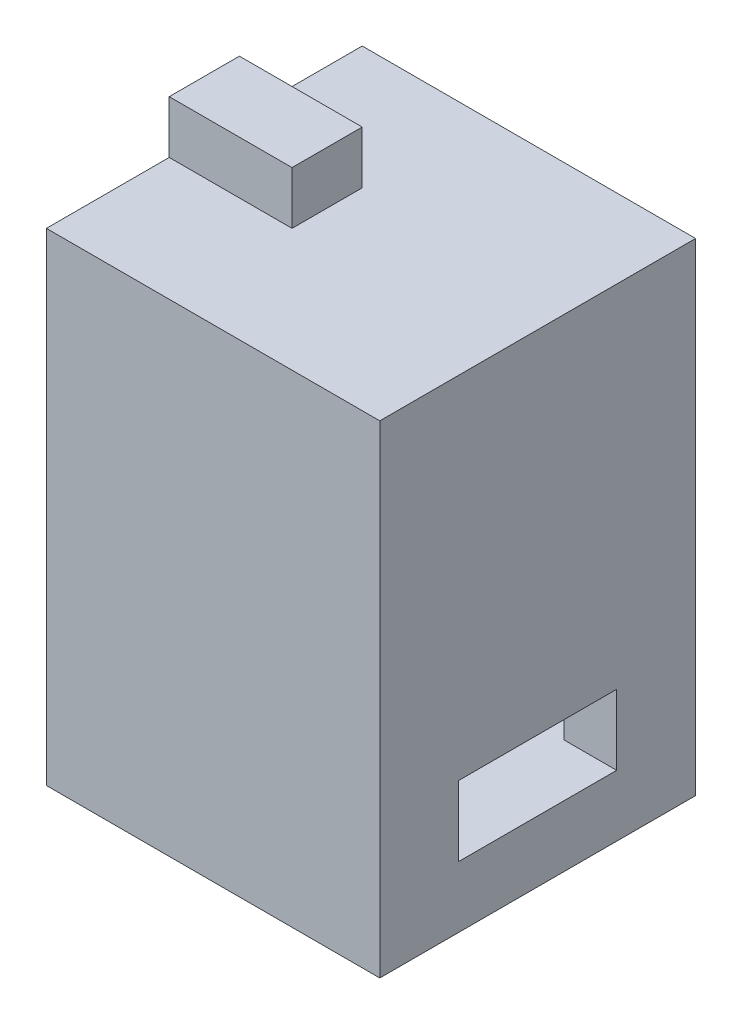
ISO-10303-21;
HEADER;
FILE_DESCRIPTION(('STEP AP214'),'2;1');
FILE_NAME('part.step','',(''),(''),'','','');
FILE_SCHEMA(('AUTOMOTIVE_DESIGN { 1 0 10303 214 1 1 1 1 }'));
ENDSEC;
DATA;
#1=APPLICATION_CONTEXT('core data for automotive mechanical design processes');
#2=APPLICATION_PROTOCOL_DEFINITION('international standard','automotive_design',2000,#1);
#3=PRODUCT_CONTEXT('',#1,'mechanical');
#4=PRODUCT('Part','Part','',(#3));
#5=PRODUCT_RELATED_PRODUCT_CATEGORY('part','',(#4));
#6=PRODUCT_DEFINITION_FORMATION('','',#4);
#7=PRODUCT_DEFINITION_CONTEXT('part definition',#1,'design');
#8=PRODUCT_DEFINITION('design','',#6,#7);
#9=PRODUCT_DEFINITION_SHAPE('','',#8);
#10=(LENGTH_UNIT() NAMED_UNIT(*) SI_UNIT(.MILLI.,.METRE.));
#11=(NAMED_UNIT(*) PLANE_ANGLE_UNIT() SI_UNIT($,.RADIAN.));
#12=(NAMED_UNIT(*) SI_UNIT($,.STERADIAN.) SOLID_ANGLE_UNIT());
#13=UNCERTAINTY_MEASURE_WITH_UNIT(LENGTH_MEASURE(1.E-05),#10,'distance_accuracy_value','');
#14=(GEOMETRIC_REPRESENTATION_CONTEXT(3) GLOBAL_UNCERTAINTY_ASSIGNED_CONTEXT((#13)) GLOBAL_UNIT_ASSIGNED_CONTEXT((#10,
#11,#12)) REPRESENTATION_CONTEXT('',''));
#15=CARTESIAN_POINT('',(0.,0.,0.));
#16=DIRECTION('',(0.,0.,1.));
#17=DIRECTION('',(1.,0.,0.));
#18=AXIS2_PLACEMENT_3D('',#15,#16,#17);
#19=CARTESIAN_POINT('',(19.,0.,0.));
#20=DIRECTION('',(-1.,0.,0.));
#21=DIRECTION('',(0.,0.,1.));
#22=AXIS2_PLACEMENT_3D('',#19,#20,#21);
#23=PLANE('',#22);
#24=DIRECTION('',(0.,0.,-1.));
#25=VECTOR('',#24,1.);
#26=CARTESIAN_POINT('',(19.,67.025,0.));
#27=LINE('',#26,#25);
#28=CARTESIAN_POINT('',(19.,67.025,37.2));
#29=VERTEX_POINT('',#28);
#30=CARTESIAN_POINT('',(19.,67.025,28.2));
#31=VERTEX_POINT('',#30);
#32=EDGE_CURVE('E174',#29,#31,#27,.T.);
#33=ORIENTED_EDGE('',*,*,#32,.T.);
#34=DIRECTION('',(0.,-1.,0.));
#35=VECTOR('',#34,1.);
#36=CARTESIAN_POINT('',(19.,0.,28.2));
#37=LINE('',#36,#35);
#38=CARTESIAN_POINT('',(19.,63.025,28.2));
#39=VERTEX_POINT('',#38);
#40=EDGE_CURVE('E12',#31,#39,#37,.T.);
#41=ORIENTED_EDGE('',*,*,#40,.T.);
#42=DIRECTION('',(0.,0.,1.));
#43=VECTOR('',#42,1.);
#44=CARTESIAN_POINT('',(19.,63.025,0.));
#45=LINE('',#44,#43);
#46=CARTESIAN_POINT('',(19.,63.025,37.2));
#47=VERTEX_POINT('',#46);
#48=EDGE_CURVE('E288',#39,#47,#45,.T.);
#49=ORIENTED_EDGE('',*,*,#48,.T.);
#50=DIRECTION('',(0.,1.,0.));
#51=VECTOR('',#50,1.);
#52=CARTESIAN_POINT('',(19.,0.,37.2));
#53=LINE('',#52,#51);
#54=EDGE_CURVE('E381',#47,#29,#53,.T.);
#55=ORIENTED_EDGE('',*,*,#54,.T.);
#56=EDGE_LOOP('',(#33,#41,#49,#55));
#57=FACE_BOUND('',#56,.T.);
#58=DIRECTION('',(0.,1.,0.));
#59=VECTOR('',#58,1.);
#60=CARTESIAN_POINT('',(19.,23.025,41.7));
#61=LINE('',#60,#59);
#62=CARTESIAN_POINT('',(19.,59.525,41.7));
#63=VERTEX_POINT('',#62);
#64=CARTESIAN_POINT('',(19.,87.025,41.7));
#65=VERTEX_POINT('',#64);
#66=EDGE_CURVE('E349',#63,#65,#61,.T.);
#67=ORIENTED_EDGE('',*,*,#66,.F.);
#68=DIRECTION('',(0.,0.,-1.));
#69=VECTOR('',#68,1.);
#70=CARTESIAN_POINT('',(19.,59.525,23.7));
#71=LINE('',#70,#69);
#72=CARTESIAN_POINT('',(19.,59.525,23.7));
#73=VERTEX_POINT('',#72);
#74=EDGE_CURVE('E401',#63,#73,#71,.T.);
#75=ORIENTED_EDGE('',*,*,#74,.T.);
#76=DIRECTION('',(0.,-1.,0.));
#77=VECTOR('',#76,1.);
#78=CARTESIAN_POINT('',(19.,23.025,23.7));
#79=LINE('',#78,#77);
#80=CARTESIAN_POINT('',(19.,87.025,23.7));
#81=VERTEX_POINT('',#80);
#82=EDGE_CURVE('E357',#81,#73,#79,.T.);
#83=ORIENTED_EDGE('',*,*,#82,.F.);
#84=DIRECTION('',(0.,0.,-1.));
#85=VECTOR('',#84,1.);
#86=CARTESIAN_POINT('',(19.,87.025,41.7));
#87=LINE('',#86,#85);
#88=EDGE_CURVE('E352',#65,#81,#87,.T.);
#89=ORIENTED_EDGE('',*,*,#88,.F.);
#90=EDGE_LOOP('',(#67,#75,#83,#89));
#91=FACE_BOUND('',#90,.T.);
#92=ADVANCED_FACE('F166',(#57,#91),#23,.F.);
#93=CARTESIAN_POINT('',(0.,0.,0.));
#94=DIRECTION('',(-1.,0.,0.));
#95=DIRECTION('',(0.,0.,1.));
#96=AXIS2_PLACEMENT_3D('',#93,#94,#95);
#97=PLANE('',#96);
#98=DIRECTION('',(0.,0.,-1.));
#99=VECTOR('',#98,1.);
#100=CARTESIAN_POINT('',(0.,59.525,23.7));
#101=LINE('',#100,#99);
#102=CARTESIAN_POINT('',(0.,59.525,41.7));
#103=VERTEX_POINT('',#102);
#104=CARTESIAN_POINT('',(0.,59.525,23.7));
#105=VERTEX_POINT('',#104);
#106=EDGE_CURVE('E396',#103,#105,#101,.T.);
#107=ORIENTED_EDGE('',*,*,#106,.F.);
#108=DIRECTION('',(0.,1.,0.));
#109=VECTOR('',#108,1.);
#110=CARTESIAN_POINT('',(0.,23.025,41.7));
#111=LINE('',#110,#109);
#112=CARTESIAN_POINT('',(0.,87.025,41.7));
#113=VERTEX_POINT('',#112);
#114=EDGE_CURVE('E340',#103,#113,#111,.T.);
#115=ORIENTED_EDGE('',*,*,#114,.T.);
#116=DIRECTION('',(0.,0.,-1.));
#117=VECTOR('',#116,1.);
#118=CARTESIAN_POINT('',(0.,87.025,41.7));
#119=LINE('',#118,#117);
#120=CARTESIAN_POINT('',(0.,87.025,34.7));
#121=VERTEX_POINT('',#120);
#122=EDGE_CURVE('E365',#113,#121,#119,.T.);
#123=ORIENTED_EDGE('',*,*,#122,.T.);
#124=DIRECTION('',(0.,1.,0.));
#125=VECTOR('',#124,1.);
#126=CARTESIAN_POINT('',(0.,87.025,34.7));
#127=LINE('',#126,#125);
#128=CARTESIAN_POINT('',(0.,90.025,34.7));
#129=VERTEX_POINT('',#128);
#130=EDGE_CURVE('E419',#121,#129,#127,.T.);
#131=ORIENTED_EDGE('',*,*,#130,.T.);
#132=DIRECTION('',(0.,0.,-1.));
#133=VECTOR('',#132,1.);
#134=CARTESIAN_POINT('',(0.,90.025,34.7));
#135=LINE('',#134,#133);
#136=CARTESIAN_POINT('',(0.,90.025,30.7));
#137=VERTEX_POINT('',#136);
#138=EDGE_CURVE('E451',#129,#137,#135,.T.);
#139=ORIENTED_EDGE('',*,*,#138,.T.);
#140=DIRECTION('',(0.,-1.,0.));
#141=VECTOR('',#140,1.);
#142=CARTESIAN_POINT('',(0.,87.025,30.7));
#143=LINE('',#142,#141);
#144=CARTESIAN_POINT('',(0.,87.025,30.7));
#145=VERTEX_POINT('',#144);
#146=EDGE_CURVE('E436',#137,#145,#143,.T.);
#147=ORIENTED_EDGE('',*,*,#146,.T.);
#148=CARTESIAN_POINT('',(0.,87.025,23.7));
#149=VERTEX_POINT('',#148);
#150=EDGE_CURVE('E364',#145,#149,#119,.T.);
#151=ORIENTED_EDGE('',*,*,#150,.T.);
#152=DIRECTION('',(0.,-1.,0.));
#153=VECTOR('',#152,1.);
#154=CARTESIAN_POINT('',(0.,23.025,23.7));
#155=LINE('',#154,#153);
#156=EDGE_CURVE('E353',#149,#105,#155,.T.);
#157=ORIENTED_EDGE('',*,*,#156,.T.);
#158=EDGE_LOOP('',(#107,#115,#123,#131,#139,#147,#151,#157));
#159=FACE_BOUND('',#158,.T.);
#160=CARTESIAN_POINT('',(0.,87.925,32.7));
#161=DIRECTION('',(-1.,0.,0.));
#162=DIRECTION('',(0.,0.,1.));
#163=AXIS2_PLACEMENT_3D('',#160,#161,#162);
#164=CIRCLE('',#163,0.937500000000002);
#165=CARTESIAN_POINT('',(0.,87.925,33.6375));
#166=VERTEX_POINT('',#165);
#167=EDGE_CURVE('E420',#166,#166,#164,.T.);
#168=ORIENTED_EDGE('',*,*,#167,.F.);
#169=EDGE_LOOP('',(#168));
#170=FACE_BOUND('',#169,.T.);
#171=CARTESIAN_POINT('',(0.,61.025,32.7));
#172=DIRECTION('',(-1.,0.,0.));
#173=DIRECTION('',(0.,0.,1.));
#174=AXIS2_PLACEMENT_3D('',#171,#172,#173);
#175=CIRCLE('',#174,0.937500000000002);
#176=CARTESIAN_POINT('',(0.,61.025,33.6375));
#177=VERTEX_POINT('',#176);
#178=EDGE_CURVE('E412',#177,#177,#175,.T.);
#179=ORIENTED_EDGE('',*,*,#178,.F.);
#180=EDGE_LOOP('',(#179));
#181=FACE_BOUND('',#180,.T.);
#182=DIRECTION('',(0.,-1.,0.));
#183=VECTOR('',#182,1.);
#184=CARTESIAN_POINT('',(0.,85.925,26.45));
#185=LINE('',#184,#183);
#186=CARTESIAN_POINT('',(0.,85.925,26.45));
#187=VERTEX_POINT('',#186);
#188=CARTESIAN_POINT('',(0.,63.025,26.45));
#189=VERTEX_POINT('',#188);
#190=EDGE_CURVE('E322',#187,#189,#185,.T.);
#191=ORIENTED_EDGE('',*,*,#190,.F.);
#192=DIRECTION('',(0.,0.,-1.));
#193=VECTOR('',#192,1.);
#194=CARTESIAN_POINT('',(0.,85.925,26.45));
#195=LINE('',#194,#193);
#196=CARTESIAN_POINT('',(0.,85.925,38.95));
#197=VERTEX_POINT('',#196);
#198=EDGE_CURVE('E333',#197,#187,#195,.T.);
#199=ORIENTED_EDGE('',*,*,#198,.F.);
#200=DIRECTION('',(0.,1.,0.));
#201=VECTOR('',#200,1.);
#202=CARTESIAN_POINT('',(0.,85.925,38.95));
#203=LINE('',#202,#201);
#204=CARTESIAN_POINT('',(0.,63.025,38.95));
#205=VERTEX_POINT('',#204);
#206=EDGE_CURVE('E329',#205,#197,#203,.T.);
#207=ORIENTED_EDGE('',*,*,#206,.F.);
#208=DIRECTION('',(0.,0.,1.));
#209=VECTOR('',#208,1.);
#210=CARTESIAN_POINT('',(0.,63.025,26.45));
#211=LINE('',#210,#209);
#212=EDGE_CURVE('E325',#189,#205,#211,.T.);
#213=ORIENTED_EDGE('',*,*,#212,.F.);
#214=EDGE_LOOP('',(#191,#199,#207,#213));
#215=FACE_BOUND('',#214,.T.);
#216=ADVANCED_FACE('F477',(#159,#170,#181,#215),#97,.T.);
#217=CARTESIAN_POINT('',(19.,23.025,41.7));
#218=DIRECTION('',(0.,0.,1.));
#219=DIRECTION('',(0.,-1.,0.));
#220=AXIS2_PLACEMENT_3D('',#217,#218,#219);
#221=PLANE('',#220);
#222=DIRECTION('',(-1.,0.,0.));
#223=VECTOR('',#222,1.);
#224=CARTESIAN_POINT('',(19.,59.525,41.7));
#225=LINE('',#224,#223);
#226=EDGE_CURVE('E405',#63,#103,#225,.T.);
#227=ORIENTED_EDGE('',*,*,#226,.F.);
#228=ORIENTED_EDGE('',*,*,#66,.T.);
#229=DIRECTION('',(-1.,0.,0.));
#230=VECTOR('',#229,1.);
#231=CARTESIAN_POINT('',(19.,87.025,41.7));
#232=LINE('',#231,#230);
#233=EDGE_CURVE('E361',#65,#113,#232,.T.);
#234=ORIENTED_EDGE('',*,*,#233,.T.);
#235=ORIENTED_EDGE('',*,*,#114,.F.);
#236=EDGE_LOOP('',(#227,#228,#234,#235));
#237=FACE_BOUND('',#236,.T.);
#238=ADVANCED_FACE('F501',(#237),#221,.T.);
#239=CARTESIAN_POINT('',(19.,23.025,23.7));
#240=DIRECTION('',(0.,0.,-1.));
#241=DIRECTION('',(-1.,0.,0.));
#242=AXIS2_PLACEMENT_3D('',#239,#240,#241);
#243=PLANE('',#242);
#244=DIRECTION('',(-1.,0.,0.));
#245=VECTOR('',#244,1.);
#246=CARTESIAN_POINT('',(19.,59.525,23.7));
#247=LINE('',#246,#245);
#248=EDGE_CURVE('E408',#73,#105,#247,.T.);
#249=ORIENTED_EDGE('',*,*,#248,.T.);
#250=ORIENTED_EDGE('',*,*,#156,.F.);
#251=DIRECTION('',(-1.,0.,0.));
#252=VECTOR('',#251,1.);
#253=CARTESIAN_POINT('',(19.,87.025,23.7));
#254=LINE('',#253,#252);
#255=EDGE_CURVE('E372',#81,#149,#254,.T.);
#256=ORIENTED_EDGE('',*,*,#255,.F.);
#257=ORIENTED_EDGE('',*,*,#82,.T.);
#258=EDGE_LOOP('',(#249,#250,#256,#257));
#259=FACE_BOUND('',#258,.T.);
#260=ADVANCED_FACE('F497',(#259),#243,.T.);
#261=CARTESIAN_POINT('',(19.,87.025,41.7));
#262=DIRECTION('',(0.,1.,0.));
#263=DIRECTION('',(0.,0.,1.));
#264=AXIS2_PLACEMENT_3D('',#261,#262,#263);
#265=PLANE('',#264);
#266=DIRECTION('',(-1.,0.,0.));
#267=VECTOR('',#266,1.);
#268=CARTESIAN_POINT('',(7.,87.025,30.7));
#269=LINE('',#268,#267);
#270=CARTESIAN_POINT('',(7.,87.025,30.7));
#271=VERTEX_POINT('',#270);
#272=EDGE_CURVE('E461',#271,#145,#269,.T.);
#273=ORIENTED_EDGE('',*,*,#272,.F.);
#274=DIRECTION('',(0.,0.,1.));
#275=VECTOR('',#274,1.);
#276=CARTESIAN_POINT('',(7.,87.025,34.7));
#277=LINE('',#276,#275);
#278=CARTESIAN_POINT('',(7.,87.025,34.7));
#279=VERTEX_POINT('',#278);
#280=EDGE_CURVE('E443',#271,#279,#277,.T.);
#281=ORIENTED_EDGE('',*,*,#280,.T.);
#282=DIRECTION('',(-1.,0.,0.));
#283=VECTOR('',#282,1.);
#284=CARTESIAN_POINT('',(7.,87.025,34.7));
#285=LINE('',#284,#283);
#286=EDGE_CURVE('E326',#279,#121,#285,.T.);
#287=ORIENTED_EDGE('',*,*,#286,.T.);
#288=ORIENTED_EDGE('',*,*,#122,.F.);
#289=ORIENTED_EDGE('',*,*,#233,.F.);
#290=ORIENTED_EDGE('',*,*,#88,.T.);
#291=ORIENTED_EDGE('',*,*,#255,.T.);
#292=ORIENTED_EDGE('',*,*,#150,.F.);
#293=EDGE_LOOP('',(#273,#281,#287,#288,#289,#290,#291,#292));
#294=FACE_BOUND('',#293,.T.);
#295=ADVANCED_FACE('F484',(#294),#265,.T.);
#296=CARTESIAN_POINT('',(16.,85.925,26.45));
#297=DIRECTION('',(0.,0.,-1.));
#298=DIRECTION('',(-1.,0.,0.));
#299=AXIS2_PLACEMENT_3D('',#296,#297,#298);
#300=PLANE('',#299);
#301=ORIENTED_EDGE('',*,*,#190,.T.);
#302=DIRECTION('',(-1.,0.,0.));
#303=VECTOR('',#302,1.);
#304=CARTESIAN_POINT('',(16.,63.025,26.45));
#305=LINE('',#304,#303);
#306=CARTESIAN_POINT('',(16.,63.025,26.45));
#307=VERTEX_POINT('',#306);
#308=EDGE_CURVE('E321',#307,#189,#305,.T.);
#309=ORIENTED_EDGE('',*,*,#308,.F.);
#310=DIRECTION('',(0.,-1.,0.));
#311=VECTOR('',#310,1.);
#312=CARTESIAN_POINT('',(16.,85.925,26.45));
#313=LINE('',#312,#311);
#314=CARTESIAN_POINT('',(16.,85.925,26.45));
#315=VERTEX_POINT('',#314);
#316=EDGE_CURVE('E306',#315,#307,#313,.T.);
#317=ORIENTED_EDGE('',*,*,#316,.F.);
#318=DIRECTION('',(-1.,0.,0.));
#319=VECTOR('',#318,1.);
#320=CARTESIAN_POINT('',(16.,85.925,26.45));
#321=LINE('',#320,#319);
#322=EDGE_CURVE('E337',#315,#187,#321,.T.);
#323=ORIENTED_EDGE('',*,*,#322,.T.);
#324=EDGE_LOOP('',(#301,#309,#317,#323));
#325=FACE_BOUND('',#324,.T.);
#326=ADVANCED_FACE('F529',(#325),#300,.F.);
#327=CARTESIAN_POINT('',(16.,85.925,26.45));
#328=DIRECTION('',(0.,1.,0.));
#329=DIRECTION('',(0.,0.,1.));
#330=AXIS2_PLACEMENT_3D('',#327,#328,#329);
#331=PLANE('',#330);
#332=ORIENTED_EDGE('',*,*,#198,.T.);
#333=ORIENTED_EDGE('',*,*,#322,.F.);
#334=DIRECTION('',(0.,0.,-1.));
#335=VECTOR('',#334,1.);
#336=CARTESIAN_POINT('',(16.,85.925,26.45));
#337=LINE('',#336,#335);
#338=CARTESIAN_POINT('',(16.,85.925,38.95));
#339=VERTEX_POINT('',#338);
#340=EDGE_CURVE('E314',#339,#315,#337,.T.);
#341=ORIENTED_EDGE('',*,*,#340,.F.);
#342=DIRECTION('',(-1.,0.,0.));
#343=VECTOR('',#342,1.);
#344=CARTESIAN_POINT('',(16.,85.925,38.95));
#345=LINE('',#344,#343);
#346=EDGE_CURVE('E341',#339,#197,#345,.T.);
#347=ORIENTED_EDGE('',*,*,#346,.T.);
#348=EDGE_LOOP('',(#332,#333,#341,#347));
#349=FACE_BOUND('',#348,.T.);
#350=ADVANCED_FACE('F534',(#349),#331,.F.);
#351=CARTESIAN_POINT('',(16.,85.925,38.95));
#352=DIRECTION('',(0.,0.,1.));
#353=DIRECTION('',(1.,0.,0.));
#354=AXIS2_PLACEMENT_3D('',#351,#352,#353);
#355=PLANE('',#354);
#356=ORIENTED_EDGE('',*,*,#206,.T.);
#357=ORIENTED_EDGE('',*,*,#346,.F.);
#358=DIRECTION('',(0.,1.,0.));
#359=VECTOR('',#358,1.);
#360=CARTESIAN_POINT('',(16.,85.925,38.95));
#361=LINE('',#360,#359);
#362=CARTESIAN_POINT('',(16.,63.025,38.95));
#363=VERTEX_POINT('',#362);
#364=EDGE_CURVE('E308',#363,#339,#361,.T.);
#365=ORIENTED_EDGE('',*,*,#364,.F.);
#366=DIRECTION('',(-1.,0.,0.));
#367=VECTOR('',#366,1.);
#368=CARTESIAN_POINT('',(16.,63.025,38.95));
#369=LINE('',#368,#367);
#370=EDGE_CURVE('E344',#363,#205,#369,.T.);
#371=ORIENTED_EDGE('',*,*,#370,.T.);
#372=EDGE_LOOP('',(#356,#357,#365,#371));
#373=FACE_BOUND('',#372,.T.);
#374=ADVANCED_FACE('F537',(#373),#355,.F.);
#375=CARTESIAN_POINT('',(16.,63.025,26.45));
#376=DIRECTION('',(0.,-1.,0.));
#377=DIRECTION('',(0.,0.,-1.));
#378=AXIS2_PLACEMENT_3D('',#375,#376,#377);
#379=PLANE('',#378);
#380=ORIENTED_EDGE('',*,*,#212,.T.);
#381=ORIENTED_EDGE('',*,*,#370,.F.);
#382=DIRECTION('',(0.,0.,1.));
#383=VECTOR('',#382,1.);
#384=CARTESIAN_POINT('',(16.,63.025,26.45));
#385=LINE('',#384,#383);
#386=CARTESIAN_POINT('',(16.,63.025,37.2));
#387=VERTEX_POINT('',#386);
#388=EDGE_CURVE('E309',#387,#363,#385,.T.);
#389=ORIENTED_EDGE('',*,*,#388,.F.);
#390=DIRECTION('',(-1.,0.,0.));
#391=VECTOR('',#390,1.);
#392=CARTESIAN_POINT('',(26.,63.025,37.2));
#393=LINE('',#392,#391);
#394=EDGE_CURVE('E188',#47,#387,#393,.T.);
#395=ORIENTED_EDGE('',*,*,#394,.F.);
#396=ORIENTED_EDGE('',*,*,#48,.F.);
#397=DIRECTION('',(-1.,0.,0.));
#398=VECTOR('',#397,1.);
#399=CARTESIAN_POINT('',(26.,63.025,28.2));
#400=LINE('',#399,#398);
#401=CARTESIAN_POINT('',(16.,63.025,28.2));
#402=VERTEX_POINT('',#401);
#403=EDGE_CURVE('E279',#39,#402,#400,.T.);
#404=ORIENTED_EDGE('',*,*,#403,.T.);
#405=EDGE_CURVE('E285',#307,#402,#385,.T.);
#406=ORIENTED_EDGE('',*,*,#405,.F.);
#407=ORIENTED_EDGE('',*,*,#308,.T.);
#408=EDGE_LOOP('',(#380,#381,#389,#395,#396,#404,#406,#407));
#409=FACE_BOUND('',#408,.T.);
#410=ADVANCED_FACE('F282',(#409),#379,.F.);
#411=CARTESIAN_POINT('',(16.,0.,0.));
#412=DIRECTION('',(-1.,0.,0.));
#413=DIRECTION('',(0.,0.,1.));
#414=AXIS2_PLACEMENT_3D('',#411,#412,#413);
#415=PLANE('',#414);
#416=DIRECTION('',(0.,-1.,0.));
#417=VECTOR('',#416,1.);
#418=CARTESIAN_POINT('',(16.,63.025,28.2));
#419=LINE('',#418,#417);
#420=CARTESIAN_POINT('',(16.,67.025,28.2));
#421=VERTEX_POINT('',#420);
#422=EDGE_CURVE('E294',#421,#402,#419,.T.);
#423=ORIENTED_EDGE('',*,*,#422,.F.);
#424=DIRECTION('',(0.,0.,-1.));
#425=VECTOR('',#424,1.);
#426=CARTESIAN_POINT('',(16.,67.025,28.2));
#427=LINE('',#426,#425);
#428=CARTESIAN_POINT('',(16.,67.025,37.2));
#429=VERTEX_POINT('',#428);
#430=EDGE_CURVE('E291',#429,#421,#427,.T.);
#431=ORIENTED_EDGE('',*,*,#430,.F.);
#432=DIRECTION('',(0.,1.,0.));
#433=VECTOR('',#432,1.);
#434=CARTESIAN_POINT('',(16.,63.025,37.2));
#435=LINE('',#434,#433);
#436=EDGE_CURVE('E181',#387,#429,#435,.T.);
#437=ORIENTED_EDGE('',*,*,#436,.F.);
#438=ORIENTED_EDGE('',*,*,#388,.T.);
#439=ORIENTED_EDGE('',*,*,#364,.T.);
#440=ORIENTED_EDGE('',*,*,#340,.T.);
#441=ORIENTED_EDGE('',*,*,#316,.T.);
#442=ORIENTED_EDGE('',*,*,#405,.T.);
#443=EDGE_LOOP('',(#423,#431,#437,#438,#439,#440,#441,#442));
#444=FACE_BOUND('',#443,.T.);
#445=ADVANCED_FACE('F303',(#444),#415,.T.);
#446=CARTESIAN_POINT('',(7.,87.025,34.7));
#447=DIRECTION('',(0.,0.,1.));
#448=DIRECTION('',(1.,0.,0.));
#449=AXIS2_PLACEMENT_3D('',#446,#447,#448);
#450=PLANE('',#449);
#451=ORIENTED_EDGE('',*,*,#130,.F.);
#452=ORIENTED_EDGE('',*,*,#286,.F.);
#453=DIRECTION('',(0.,1.,0.));
#454=VECTOR('',#453,1.);
#455=CARTESIAN_POINT('',(7.,87.025,34.7));
#456=LINE('',#455,#454);
#457=CARTESIAN_POINT('',(7.,90.025,34.7));
#458=VERTEX_POINT('',#457);
#459=EDGE_CURVE('E431',#279,#458,#456,.T.);
#460=ORIENTED_EDGE('',*,*,#459,.T.);
#461=DIRECTION('',(-1.,0.,0.));
#462=VECTOR('',#461,1.);
#463=CARTESIAN_POINT('',(7.,90.025,34.7));
#464=LINE('',#463,#462);
#465=EDGE_CURVE('E447',#458,#129,#464,.T.);
#466=ORIENTED_EDGE('',*,*,#465,.T.);
#467=EDGE_LOOP('',(#451,#452,#460,#466));
#468=FACE_BOUND('',#467,.T.);
#469=ADVANCED_FACE('F469',(#468),#450,.T.);
#470=CARTESIAN_POINT('',(7.,87.025,30.7));
#471=DIRECTION('',(0.,0.,-1.));
#472=DIRECTION('',(0.,1.,0.));
#473=AXIS2_PLACEMENT_3D('',#470,#471,#472);
#474=PLANE('',#473);
#475=ORIENTED_EDGE('',*,*,#146,.F.);
#476=DIRECTION('',(-1.,0.,0.));
#477=VECTOR('',#476,1.);
#478=CARTESIAN_POINT('',(7.,90.025,30.7));
#479=LINE('',#478,#477);
#480=CARTESIAN_POINT('',(7.,90.025,30.7));
#481=VERTEX_POINT('',#480);
#482=EDGE_CURVE('E464',#481,#137,#479,.T.);
#483=ORIENTED_EDGE('',*,*,#482,.F.);
#484=DIRECTION('',(0.,-1.,0.));
#485=VECTOR('',#484,1.);
#486=CARTESIAN_POINT('',(7.,87.025,30.7));
#487=LINE('',#486,#485);
#488=EDGE_CURVE('E440',#481,#271,#487,.T.);
#489=ORIENTED_EDGE('',*,*,#488,.T.);
#490=ORIENTED_EDGE('',*,*,#272,.T.);
#491=EDGE_LOOP('',(#475,#483,#489,#490));
#492=FACE_BOUND('',#491,.T.);
#493=ADVANCED_FACE('F491',(#492),#474,.T.);
#494=CARTESIAN_POINT('',(7.,90.025,34.7));
#495=DIRECTION('',(0.,1.,0.));
#496=DIRECTION('',(0.,0.,1.));
#497=AXIS2_PLACEMENT_3D('',#494,#495,#496);
#498=PLANE('',#497);
#499=ORIENTED_EDGE('',*,*,#138,.F.);
#500=ORIENTED_EDGE('',*,*,#465,.F.);
#501=DIRECTION('',(0.,0.,-1.));
#502=VECTOR('',#501,1.);
#503=CARTESIAN_POINT('',(7.,90.025,34.7));
#504=LINE('',#503,#502);
#505=EDGE_CURVE('E435',#458,#481,#504,.T.);
#506=ORIENTED_EDGE('',*,*,#505,.T.);
#507=ORIENTED_EDGE('',*,*,#482,.T.);
#508=EDGE_LOOP('',(#499,#500,#506,#507));
#509=FACE_BOUND('',#508,.T.);
#510=ADVANCED_FACE('F473',(#509),#498,.T.);
#511=CARTESIAN_POINT('',(7.,0.,0.));
#512=DIRECTION('',(-1.,0.,0.));
#513=DIRECTION('',(0.,0.,1.));
#514=AXIS2_PLACEMENT_3D('',#511,#512,#513);
#515=PLANE('',#514);
#516=ORIENTED_EDGE('',*,*,#459,.F.);
#517=ORIENTED_EDGE('',*,*,#280,.F.);
#518=ORIENTED_EDGE('',*,*,#488,.F.);
#519=ORIENTED_EDGE('',*,*,#505,.F.);
#520=EDGE_LOOP('',(#516,#517,#518,#519));
#521=FACE_BOUND('',#520,.T.);
#522=ADVANCED_FACE('F488',(#521),#515,.F.);
#523=CARTESIAN_POINT('',(6.5,61.025,32.7));
#524=DIRECTION('',(-1.,0.,0.));
#525=DIRECTION('',(0.,0.,1.));
#526=AXIS2_PLACEMENT_3D('',#523,#524,#525);
#527=CYLINDRICAL_SURFACE('',#526,0.937500000000002);
#528=CARTESIAN_POINT('',(6.5,61.025,32.7));
#529=DIRECTION('',(-1.,0.,0.));
#530=DIRECTION('',(0.,0.,1.));
#531=AXIS2_PLACEMENT_3D('',#528,#529,#530);
#532=CIRCLE('',#531,0.937500000000002);
#533=CARTESIAN_POINT('',(6.5,61.025,33.6375));
#534=VERTEX_POINT('',#533);
#535=EDGE_CURVE('E424',#534,#534,#532,.T.);
#536=CARTESIAN_POINT('',(6.5,61.025,33.6375));
#537=CARTESIAN_POINT('',(6.43229166666667,61.025,33.6375));
#538=CARTESIAN_POINT('',(6.36458333333333,61.025,33.6375));
#539=CARTESIAN_POINT('',(6.22916666666667,61.025,33.6375));
#540=CARTESIAN_POINT('',(6.16145833333333,61.025,33.6375));
#541=CARTESIAN_POINT('',(6.02604166666667,61.025,33.6375));
#542=CARTESIAN_POINT('',(5.95833333333333,61.025,33.6375));
#543=CARTESIAN_POINT('',(5.82291666666667,61.025,33.6375));
#544=CARTESIAN_POINT('',(5.75520833333333,61.025,33.6375));
#545=CARTESIAN_POINT('',(5.61979166666667,61.025,33.6375));
#546=CARTESIAN_POINT('',(5.55208333333333,61.025,33.6375));
#547=CARTESIAN_POINT('',(5.41666666666667,61.025,33.6375));
#548=CARTESIAN_POINT('',(5.34895833333333,61.025,33.6375));
#549=CARTESIAN_POINT('',(5.21354166666667,61.025,33.6375));
#550=CARTESIAN_POINT('',(5.14583333333333,61.025,33.6375));
#551=CARTESIAN_POINT('',(5.01041666666667,61.025,33.6375));
#552=CARTESIAN_POINT('',(4.94270833333333,61.025,33.6375));
#553=CARTESIAN_POINT('',(4.80729166666667,61.025,33.6375));
#554=CARTESIAN_POINT('',(4.73958333333333,61.025,33.6375));
#555=CARTESIAN_POINT('',(4.60416666666667,61.025,33.6375));
#556=CARTESIAN_POINT('',(4.53645833333333,61.025,33.6375));
#557=CARTESIAN_POINT('',(4.40104166666667,61.025,33.6375));
#558=CARTESIAN_POINT('',(4.33333333333333,61.025,33.6375));
#559=CARTESIAN_POINT('',(4.19791666666667,61.025,33.6375));
#560=CARTESIAN_POINT('',(4.13020833333333,61.025,33.6375));
#561=CARTESIAN_POINT('',(3.99479166666667,61.025,33.6375));
#562=CARTESIAN_POINT('',(3.92708333333333,61.025,33.6375));
#563=CARTESIAN_POINT('',(3.79166666666667,61.025,33.6375));
#564=CARTESIAN_POINT('',(3.72395833333333,61.025,33.6375));
#565=CARTESIAN_POINT('',(3.58854166666667,61.025,33.6375));
#566=CARTESIAN_POINT('',(3.52083333333333,61.025,33.6375));
#567=CARTESIAN_POINT('',(3.38541666666667,61.025,33.6375));
#568=CARTESIAN_POINT('',(3.31770833333333,61.025,33.6375));
#569=CARTESIAN_POINT('',(3.18229166666667,61.025,33.6375));
#570=CARTESIAN_POINT('',(3.11458333333333,61.025,33.6375));
#571=CARTESIAN_POINT('',(2.97916666666667,61.025,33.6375));
#572=CARTESIAN_POINT('',(2.91145833333333,61.025,33.6375));
#573=CARTESIAN_POINT('',(2.77604166666667,61.025,33.6375));
#574=CARTESIAN_POINT('',(2.70833333333333,61.025,33.6375));
#575=CARTESIAN_POINT('',(2.57291666666667,61.025,33.6375));
#576=CARTESIAN_POINT('',(2.50520833333333,61.025,33.6375));
#577=CARTESIAN_POINT('',(2.36979166666667,61.025,33.6375));
#578=CARTESIAN_POINT('',(2.30208333333333,61.025,33.6375));
#579=CARTESIAN_POINT('',(2.16666666666667,61.025,33.6375));
#580=CARTESIAN_POINT('',(2.09895833333333,61.025,33.6375));
#581=CARTESIAN_POINT('',(1.96354166666667,61.025,33.6375));
#582=CARTESIAN_POINT('',(1.89583333333333,61.025,33.6375));
#583=CARTESIAN_POINT('',(1.76041666666667,61.025,33.6375));
#584=CARTESIAN_POINT('',(1.69270833333333,61.025,33.6375));
#585=CARTESIAN_POINT('',(1.55729166666667,61.025,33.6375));
#586=CARTESIAN_POINT('',(1.48958333333333,61.025,33.6375));
#587=CARTESIAN_POINT('',(1.35416666666667,61.025,33.6375));
#588=CARTESIAN_POINT('',(1.28645833333333,61.025,33.6375));
#589=CARTESIAN_POINT('',(1.15104166666667,61.025,33.6375));
#590=CARTESIAN_POINT('',(1.08333333333333,61.025,33.6375));
#591=CARTESIAN_POINT('',(0.947916666666667,61.025,33.6375));
#592=CARTESIAN_POINT('',(0.880208333333333,61.025,33.6375));
#593=CARTESIAN_POINT('',(0.744791666666667,61.025,33.6375));
#594=CARTESIAN_POINT('',(0.677083333333334,61.025,33.6375));
#595=CARTESIAN_POINT('',(0.541666666666667,61.025,33.6375));
#596=CARTESIAN_POINT('',(0.473958333333334,61.025,33.6375));
#597=CARTESIAN_POINT('',(0.338541666666667,61.025,33.6375));
#598=CARTESIAN_POINT('',(0.270833333333334,61.025,33.6375));
#599=CARTESIAN_POINT('',(0.135416666666667,61.025,33.6375));
#600=CARTESIAN_POINT('',(0.0677083333333333,61.025,33.6375));
#601=CARTESIAN_POINT('',(0.,61.025,33.6375));
#602=B_SPLINE_CURVE_WITH_KNOTS('',3,(#536,#537,#538,#539,#540,#541,#542,#543,#544,#545,#546,
#547,#548,#549,#550,#551,#552,#553,#554,#555,#556,#557,#558,#559,#560,#561,#562,#563,#564,#565,
#566,#567,#568,#569,#570,#571,#572,#573,#574,#575,#576,#577,#578,#579,#580,#581,#582,#583,#584,
#585,#586,#587,#588,#589,#590,#591,#592,#593,#594,#595,#596,#597,#598,#599,#600,#601),
.UNSPECIFIED.,.F.,.F.,(4,2,2,2,2,2,2,2,2,2,2,2,2,2,2,2,2,2,2,2,2,2,2,2,2,2,2,2,2,2,2,2,4),(0.,
0.203125,0.40625,0.609375000000001,0.812500000000001,1.015625,1.21875,1.421875,1.625,1.828125,
2.03125,2.234375,2.4375,2.640625,2.84375,3.046875,3.25,3.453125,3.65625,3.859375,4.0625,
4.265625,4.46875,4.671875,4.875,5.078125,5.28125,5.484375,5.6875,5.890625,6.09375,6.296875,6.5),.UNSPECIFIED.);
#603=EDGE_CURVE('BSEAM554',#534,#177,#602,.T.);
#604=ORIENTED_EDGE('',*,*,#535,.F.);
#605=ORIENTED_EDGE('',*,*,#178,.T.);
#606=ORIENTED_EDGE('',*,*,#603,.T.);
#607=ORIENTED_EDGE('',*,*,#603,.F.);
#608=EDGE_LOOP('',(#604,#606,#605,#607));
#609=FACE_BOUND('',#608,.T.);
#610=ADVANCED_FACE('F554',(#609),#527,.F.);
#611=CARTESIAN_POINT('',(6.5,61.025,32.7));
#612=DIRECTION('',(-1.,0.,0.));
#613=DIRECTION('',(0.,0.,1.));
#614=AXIS2_PLACEMENT_3D('',#611,#612,#613);
#615=PLANE('',#614);
#616=ORIENTED_EDGE('',*,*,#535,.T.);
#617=EDGE_LOOP('',(#616));
#618=FACE_BOUND('',#617,.T.);
#619=ADVANCED_FACE('F557',(#618),#615,.T.);
#620=CARTESIAN_POINT('',(6.5,87.925,32.7));
#621=DIRECTION('',(-1.,0.,0.));
#622=DIRECTION('',(0.,0.,1.));
#623=AXIS2_PLACEMENT_3D('',#620,#621,#622);
#624=CYLINDRICAL_SURFACE('',#623,0.937500000000002);
#625=CARTESIAN_POINT('',(6.5,87.925,32.7));
#626=DIRECTION('',(-1.,0.,0.));
#627=DIRECTION('',(0.,0.,1.));
#628=AXIS2_PLACEMENT_3D('',#625,#626,#627);
#629=CIRCLE('',#628,0.937500000000002);
#630=CARTESIAN_POINT('',(6.5,87.925,33.6375));
#631=VERTEX_POINT('',#630);
#632=EDGE_CURVE('E415',#631,#631,#629,.T.);
#633=CARTESIAN_POINT('',(6.5,87.925,33.6375));
#634=CARTESIAN_POINT('',(6.43229166666667,87.925,33.6375));
#635=CARTESIAN_POINT('',(6.36458333333333,87.925,33.6375));
#636=CARTESIAN_POINT('',(6.22916666666667,87.925,33.6375));
#637=CARTESIAN_POINT('',(6.16145833333333,87.925,33.6375));
#638=CARTESIAN_POINT('',(6.02604166666667,87.925,33.6375));
#639=CARTESIAN_POINT('',(5.95833333333333,87.925,33.6375));
#640=CARTESIAN_POINT('',(5.82291666666667,87.925,33.6375));
#641=CARTESIAN_POINT('',(5.75520833333333,87.925,33.6375));
#642=CARTESIAN_POINT('',(5.61979166666667,87.925,33.6375));
#643=CARTESIAN_POINT('',(5.55208333333333,87.925,33.6375));
#644=CARTESIAN_POINT('',(5.41666666666667,87.925,33.6375));
#645=CARTESIAN_POINT('',(5.34895833333333,87.925,33.6375));
#646=CARTESIAN_POINT('',(5.21354166666667,87.925,33.6375));
#647=CARTESIAN_POINT('',(5.14583333333333,87.925,33.6375));
#648=CARTESIAN_POINT('',(5.01041666666667,87.925,33.6375));
#649=CARTESIAN_POINT('',(4.94270833333333,87.925,33.6375));
#650=CARTESIAN_POINT('',(4.80729166666667,87.925,33.6375));
#651=CARTESIAN_POINT('',(4.73958333333333,87.925,33.6375));
#652=CARTESIAN_POINT('',(4.60416666666667,87.925,33.6375));
#653=CARTESIAN_POINT('',(4.53645833333333,87.925,33.6375));
#654=CARTESIAN_POINT('',(4.40104166666667,87.925,33.6375));
#655=CARTESIAN_POINT('',(4.33333333333333,87.925,33.6375));
#656=CARTESIAN_POINT('',(4.19791666666667,87.925,33.6375));
#657=CARTESIAN_POINT('',(4.13020833333333,87.925,33.6375));
#658=CARTESIAN_POINT('',(3.99479166666667,87.925,33.6375));
#659=CARTESIAN_POINT('',(3.92708333333333,87.925,33.6375));
#660=CARTESIAN_POINT('',(3.79166666666667,87.925,33.6375));
#661=CARTESIAN_POINT('',(3.72395833333333,87.925,33.6375));
#662=CARTESIAN_POINT('',(3.58854166666667,87.925,33.6375));
#663=CARTESIAN_POINT('',(3.52083333333333,87.925,33.6375));
#664=CARTESIAN_POINT('',(3.38541666666667,87.925,33.6375));
#665=CARTESIAN_POINT('',(3.31770833333333,87.925,33.6375));
#666=CARTESIAN_POINT('',(3.18229166666667,87.925,33.6375));
#667=CARTESIAN_POINT('',(3.11458333333333,87.925,33.6375));
#668=CARTESIAN_POINT('',(2.97916666666667,87.925,33.6375));
#669=CARTESIAN_POINT('',(2.91145833333333,87.925,33.6375));
#670=CARTESIAN_POINT('',(2.77604166666667,87.925,33.6375));
#671=CARTESIAN_POINT('',(2.70833333333333,87.925,33.6375));
#672=CARTESIAN_POINT('',(2.57291666666667,87.925,33.6375));
#673=CARTESIAN_POINT('',(2.50520833333333,87.925,33.6375));
#674=CARTESIAN_POINT('',(2.36979166666667,87.925,33.6375));
#675=CARTESIAN_POINT('',(2.30208333333333,87.925,33.6375));
#676=CARTESIAN_POINT('',(2.16666666666667,87.925,33.6375));
#677=CARTESIAN_POINT('',(2.09895833333333,87.925,33.6375));
#678=CARTESIAN_POINT('',(1.96354166666667,87.925,33.6375));
#679=CARTESIAN_POINT('',(1.89583333333333,87.925,33.6375));
#680=CARTESIAN_POINT('',(1.76041666666667,87.925,33.6375));
#681=CARTESIAN_POINT('',(1.69270833333333,87.925,33.6375));
#682=CARTESIAN_POINT('',(1.55729166666667,87.925,33.6375));
#683=CARTESIAN_POINT('',(1.48958333333333,87.925,33.6375));
#684=CARTESIAN_POINT('',(1.35416666666667,87.925,33.6375));
#685=CARTESIAN_POINT('',(1.28645833333333,87.925,33.6375));
#686=CARTESIAN_POINT('',(1.15104166666667,87.925,33.6375));
#687=CARTESIAN_POINT('',(1.08333333333333,87.925,33.6375));
#688=CARTESIAN_POINT('',(0.947916666666667,87.925,33.6375));
#689=CARTESIAN_POINT('',(0.880208333333333,87.925,33.6375));
#690=CARTESIAN_POINT('',(0.744791666666667,87.925,33.6375));
#691=CARTESIAN_POINT('',(0.677083333333334,87.925,33.6375));
#692=CARTESIAN_POINT('',(0.541666666666667,87.925,33.6375));
#693=CARTESIAN_POINT('',(0.473958333333334,87.925,33.6375));
#694=CARTESIAN_POINT('',(0.338541666666667,87.925,33.6375));
#695=CARTESIAN_POINT('',(0.270833333333334,87.925,33.6375));
#696=CARTESIAN_POINT('',(0.135416666666667,87.925,33.6375));
#697=CARTESIAN_POINT('',(0.0677083333333333,87.925,33.6375));
#698=CARTESIAN_POINT('',(0.,87.925,33.6375));
#699=B_SPLINE_CURVE_WITH_KNOTS('',3,(#633,#634,#635,#636,#637,#638,#639,#640,#641,#642,#643,
#644,#645,#646,#647,#648,#649,#650,#651,#652,#653,#654,#655,#656,#657,#658,#659,#660,#661,#662,
#663,#664,#665,#666,#667,#668,#669,#670,#671,#672,#673,#674,#675,#676,#677,#678,#679,#680,#681,
#682,#683,#684,#685,#686,#687,#688,#689,#690,#691,#692,#693,#694,#695,#696,#697,#698),
.UNSPECIFIED.,.F.,.F.,(4,2,2,2,2,2,2,2,2,2,2,2,2,2,2,2,2,2,2,2,2,2,2,2,2,2,2,2,2,2,2,2,4),(0.,
0.203125,0.40625,0.609375000000001,0.812500000000001,1.015625,1.21875,1.421875,1.625,1.828125,
2.03125,2.234375,2.4375,2.640625,2.84375,3.046875,3.25,3.453125,3.65625,3.859375,4.0625,
4.265625,4.46875,4.671875,4.875,5.078125,5.28125,5.484375,5.6875,5.890625,6.09375,6.296875,6.5),.UNSPECIFIED.);
#700=EDGE_CURVE('BSEAM513',#631,#166,#699,.T.);
#701=ORIENTED_EDGE('',*,*,#632,.F.);
#702=ORIENTED_EDGE('',*,*,#167,.T.);
#703=ORIENTED_EDGE('',*,*,#700,.T.);
#704=ORIENTED_EDGE('',*,*,#700,.F.);
#705=EDGE_LOOP('',(#701,#703,#702,#704));
#706=FACE_BOUND('',#705,.T.);
#707=ADVANCED_FACE('F513',(#706),#624,.F.);
#708=CARTESIAN_POINT('',(6.5,87.925,32.7));
#709=DIRECTION('',(-1.,0.,0.));
#710=DIRECTION('',(0.,0.,1.));
#711=AXIS2_PLACEMENT_3D('',#708,#709,#710);
#712=PLANE('',#711);
#713=ORIENTED_EDGE('',*,*,#632,.T.);
#714=EDGE_LOOP('',(#713));
#715=FACE_BOUND('',#714,.T.);
#716=ADVANCED_FACE('F505',(#715),#712,.T.);
#717=CARTESIAN_POINT('',(19.,59.525,23.7));
#718=DIRECTION('',(0.,1.,0.));
#719=DIRECTION('',(0.,0.,1.));
#720=AXIS2_PLACEMENT_3D('',#717,#718,#719);
#721=PLANE('',#720);
#722=ORIENTED_EDGE('',*,*,#106,.T.);
#723=ORIENTED_EDGE('',*,*,#248,.F.);
#724=ORIENTED_EDGE('',*,*,#74,.F.);
#725=ORIENTED_EDGE('',*,*,#226,.T.);
#726=EDGE_LOOP('',(#722,#723,#724,#725));
#727=FACE_BOUND('',#726,.T.);
#728=ADVANCED_FACE('F503',(#727),#721,.F.);
#729=CARTESIAN_POINT('',(26.,63.025,28.2));
#730=DIRECTION('',(0.,0.,-1.));
#731=DIRECTION('',(-1.,0.,0.));
#732=AXIS2_PLACEMENT_3D('',#729,#730,#731);
#733=PLANE('',#732);
#734=DIRECTION('',(-1.,0.,0.));
#735=VECTOR('',#734,1.);
#736=CARTESIAN_POINT('',(26.,67.025,28.2));
#737=LINE('',#736,#735);
#738=EDGE_CURVE('E297',#31,#421,#737,.T.);
#739=ORIENTED_EDGE('',*,*,#738,.T.);
#740=ORIENTED_EDGE('',*,*,#422,.T.);
#741=ORIENTED_EDGE('',*,*,#403,.F.);
#742=ORIENTED_EDGE('',*,*,#40,.F.);
#743=EDGE_LOOP('',(#739,#740,#741,#742));
#744=FACE_BOUND('',#743,.T.);
#745=ADVANCED_FACE('F295',(#744),#733,.F.);
#746=CARTESIAN_POINT('',(26.,67.025,28.2));
#747=DIRECTION('',(0.,1.,0.));
#748=DIRECTION('',(0.,0.,1.));
#749=AXIS2_PLACEMENT_3D('',#746,#747,#748);
#750=PLANE('',#749);
#751=DIRECTION('',(-1.,0.,0.));
#752=VECTOR('',#751,1.);
#753=CARTESIAN_POINT('',(26.,67.025,37.2));
#754=LINE('',#753,#752);
#755=EDGE_CURVE('E390',#29,#429,#754,.T.);
#756=ORIENTED_EDGE('',*,*,#755,.T.);
#757=ORIENTED_EDGE('',*,*,#430,.T.);
#758=ORIENTED_EDGE('',*,*,#738,.F.);
#759=ORIENTED_EDGE('',*,*,#32,.F.);
#760=EDGE_LOOP('',(#756,#757,#758,#759));
#761=FACE_BOUND('',#760,.T.);
#762=ADVANCED_FACE('F389',(#761),#750,.F.);
#763=CARTESIAN_POINT('',(26.,63.025,37.2));
#764=DIRECTION('',(0.,0.,1.));
#765=DIRECTION('',(1.,0.,0.));
#766=AXIS2_PLACEMENT_3D('',#763,#764,#765);
#767=PLANE('',#766);
#768=ORIENTED_EDGE('',*,*,#394,.T.);
#769=ORIENTED_EDGE('',*,*,#436,.T.);
#770=ORIENTED_EDGE('',*,*,#755,.F.);
#771=ORIENTED_EDGE('',*,*,#54,.F.);
#772=EDGE_LOOP('',(#768,#769,#770,#771));
#773=FACE_BOUND('',#772,.T.);
#774=ADVANCED_FACE('F391',(#773),#767,.F.);
#775=CLOSED_SHELL('',(#92,#216,#238,#260,#295,#326,#350,#374,#410,#445,#469,#493,#510,#522,#610,
#619,#707,#716,#728,#745,#762,#774));
#776=MANIFOLD_SOLID_BREP('B2',#775);
#777=ADVANCED_BREP_SHAPE_REPRESENTATION('',(#18,#776),#14);
#778=SHAPE_DEFINITION_REPRESENTATION(#9,#777);
ENDSEC;
END-ISO-10303-21;
